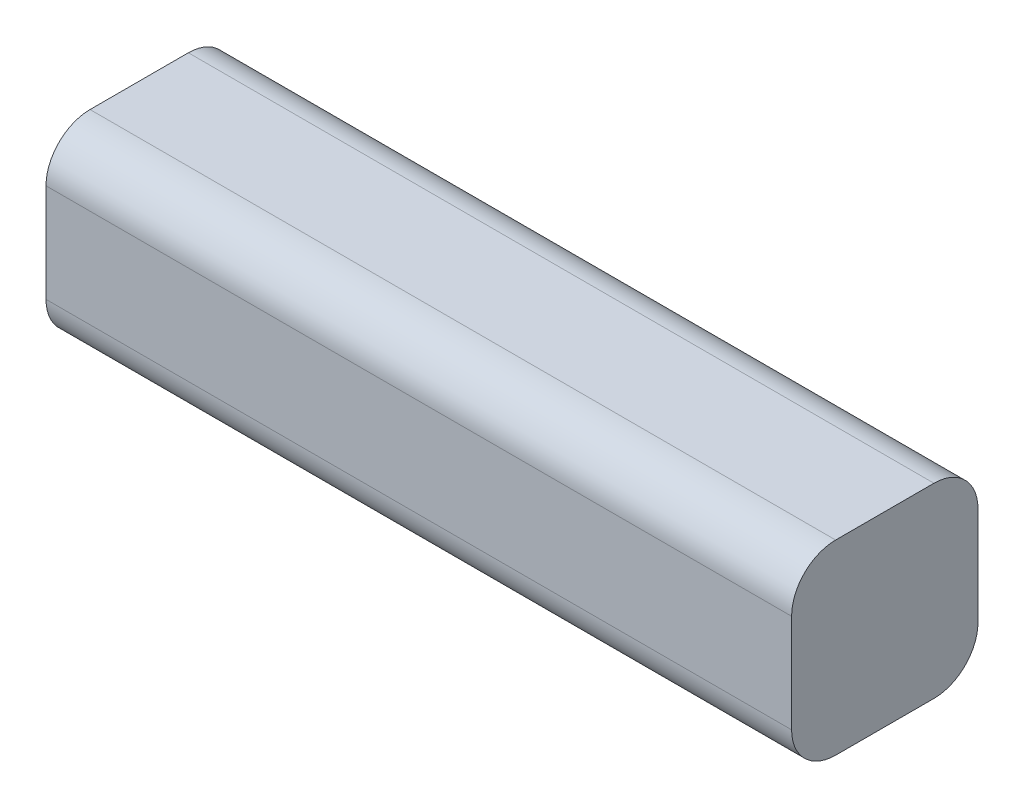
ISO-10303-21;
HEADER;
FILE_DESCRIPTION(('STEP AP214'),'2;1');
FILE_NAME('part.step','',(''),(''),'','','');
FILE_SCHEMA(('AUTOMOTIVE_DESIGN { 1 0 10303 214 1 1 1 1 }'));
ENDSEC;
DATA;
#1=APPLICATION_CONTEXT('core data for automotive mechanical design processes');
#2=APPLICATION_PROTOCOL_DEFINITION('international standard','automotive_design',2000,#1);
#3=PRODUCT_CONTEXT('',#1,'mechanical');
#4=PRODUCT('Part','Part','',(#3));
#5=PRODUCT_RELATED_PRODUCT_CATEGORY('part','',(#4));
#6=PRODUCT_DEFINITION_FORMATION('','',#4);
#7=PRODUCT_DEFINITION_CONTEXT('part definition',#1,'design');
#8=PRODUCT_DEFINITION('design','',#6,#7);
#9=PRODUCT_DEFINITION_SHAPE('','',#8);
#10=(LENGTH_UNIT() NAMED_UNIT(*) SI_UNIT(.MILLI.,.METRE.));
#11=(NAMED_UNIT(*) PLANE_ANGLE_UNIT() SI_UNIT($,.RADIAN.));
#12=(NAMED_UNIT(*) SI_UNIT($,.STERADIAN.) SOLID_ANGLE_UNIT());
#13=UNCERTAINTY_MEASURE_WITH_UNIT(LENGTH_MEASURE(1.E-05),#10,'distance_accuracy_value','');
#14=(GEOMETRIC_REPRESENTATION_CONTEXT(3) GLOBAL_UNCERTAINTY_ASSIGNED_CONTEXT((#13)) GLOBAL_UNIT_ASSIGNED_CONTEXT((#10,
#11,#12)) REPRESENTATION_CONTEXT('',''));
#15=CARTESIAN_POINT('',(0.,0.,0.));
#16=DIRECTION('',(0.,0.,1.));
#17=DIRECTION('',(1.,0.,0.));
#18=AXIS2_PLACEMENT_3D('',#15,#16,#17);
#19=CARTESIAN_POINT('',(0.,38.1,0.));
#20=DIRECTION('',(1.,0.,0.));
#21=DIRECTION('',(0.,0.,-1.));
#22=AXIS2_PLACEMENT_3D('',#19,#20,#21);
#23=PLANE('',#22);
#24=DIRECTION('',(0.,-1.,0.));
#25=VECTOR('',#24,1.);
#26=CARTESIAN_POINT('',(0.,38.1,-38.1));
#27=LINE('',#26,#25);
#28=CARTESIAN_POINT('',(0.,29.1,-38.1));
#29=VERTEX_POINT('',#28);
#30=CARTESIAN_POINT('',(0.,9.00000000000001,-38.1));
#31=VERTEX_POINT('',#30);
#32=EDGE_CURVE('E101',#29,#31,#27,.T.);
#33=ORIENTED_EDGE('',*,*,#32,.T.);
#34=CARTESIAN_POINT('',(0.,9.,-29.1));
#35=DIRECTION('',(1.,0.,0.));
#36=DIRECTION('',(0.,0.,-1.));
#37=AXIS2_PLACEMENT_3D('',#34,#35,#36);
#38=CIRCLE('',#37,9.);
#39=CARTESIAN_POINT('',(0.,0.,-29.1));
#40=VERTEX_POINT('',#39);
#41=EDGE_CURVE('E108',#31,#40,#38,.F.);
#42=ORIENTED_EDGE('',*,*,#41,.T.);
#43=DIRECTION('',(0.,0.,1.));
#44=VECTOR('',#43,1.);
#45=CARTESIAN_POINT('',(0.,0.,0.));
#46=LINE('',#45,#44);
#47=CARTESIAN_POINT('',(0.,0.,-9.));
#48=VERTEX_POINT('',#47);
#49=EDGE_CURVE('E168',#40,#48,#46,.T.);
#50=ORIENTED_EDGE('',*,*,#49,.T.);
#51=CARTESIAN_POINT('',(0.,9.,-9.));
#52=DIRECTION('',(1.,0.,0.));
#53=DIRECTION('',(0.,0.,-1.));
#54=AXIS2_PLACEMENT_3D('',#51,#52,#53);
#55=CIRCLE('',#54,9.);
#56=CARTESIAN_POINT('',(0.,9.00000000000001,0.));
#57=VERTEX_POINT('',#56);
#58=EDGE_CURVE('E109',#48,#57,#55,.F.);
#59=ORIENTED_EDGE('',*,*,#58,.T.);
#60=DIRECTION('',(0.,-1.,0.));
#61=VECTOR('',#60,1.);
#62=CARTESIAN_POINT('',(0.,38.1,0.));
#63=LINE('',#62,#61);
#64=CARTESIAN_POINT('',(0.,29.1,0.));
#65=VERTEX_POINT('',#64);
#66=EDGE_CURVE('E125',#65,#57,#63,.T.);
#67=ORIENTED_EDGE('',*,*,#66,.F.);
#68=CARTESIAN_POINT('',(0.,29.1,-9.));
#69=DIRECTION('',(1.,0.,0.));
#70=DIRECTION('',(0.,0.,-1.));
#71=AXIS2_PLACEMENT_3D('',#68,#69,#70);
#72=CIRCLE('',#71,9.);
#73=CARTESIAN_POINT('',(0.,38.1,-9.));
#74=VERTEX_POINT('',#73);
#75=EDGE_CURVE('E127',#65,#74,#72,.F.);
#76=ORIENTED_EDGE('',*,*,#75,.T.);
#77=DIRECTION('',(0.,0.,1.));
#78=VECTOR('',#77,1.);
#79=CARTESIAN_POINT('',(0.,38.1,0.));
#80=LINE('',#79,#78);
#81=CARTESIAN_POINT('',(0.,38.1,-29.1));
#82=VERTEX_POINT('',#81);
#83=EDGE_CURVE('E103',#82,#74,#80,.T.);
#84=ORIENTED_EDGE('',*,*,#83,.F.);
#85=CARTESIAN_POINT('',(0.,29.1,-29.1));
#86=DIRECTION('',(1.,0.,0.));
#87=DIRECTION('',(0.,0.,-1.));
#88=AXIS2_PLACEMENT_3D('',#85,#86,#87);
#89=CIRCLE('',#88,9.);
#90=EDGE_CURVE('E99',#82,#29,#89,.F.);
#91=ORIENTED_EDGE('',*,*,#90,.T.);
#92=EDGE_LOOP('',(#33,#42,#50,#59,#67,#76,#84,#91));
#93=FACE_BOUND('',#92,.T.);
#94=ADVANCED_FACE('F33',(#93),#23,.F.);
#95=CARTESIAN_POINT('',(0.,38.1,0.));
#96=DIRECTION('',(0.,0.,-1.));
#97=DIRECTION('',(-1.,0.,0.));
#98=AXIS2_PLACEMENT_3D('',#95,#96,#97);
#99=PLANE('',#98);
#100=ORIENTED_EDGE('',*,*,#66,.T.);
#101=DIRECTION('',(1.,0.,0.));
#102=VECTOR('',#101,1.);
#103=CARTESIAN_POINT('',(152.4,9.,0.));
#104=LINE('',#103,#102);
#105=CARTESIAN_POINT('',(152.4,9.00000000000001,0.));
#106=VERTEX_POINT('',#105);
#107=EDGE_CURVE('E11',#57,#106,#104,.T.);
#108=ORIENTED_EDGE('',*,*,#107,.T.);
#109=DIRECTION('',(0.,-1.,0.));
#110=VECTOR('',#109,1.);
#111=CARTESIAN_POINT('',(152.4,38.1,0.));
#112=LINE('',#111,#110);
#113=CARTESIAN_POINT('',(152.4,29.1,0.));
#114=VERTEX_POINT('',#113);
#115=EDGE_CURVE('E130',#114,#106,#112,.T.);
#116=ORIENTED_EDGE('',*,*,#115,.F.);
#117=DIRECTION('',(1.,0.,0.));
#118=VECTOR('',#117,1.);
#119=CARTESIAN_POINT('',(0.,29.1,0.));
#120=LINE('',#119,#118);
#121=EDGE_CURVE('E41',#114,#65,#120,.F.);
#122=ORIENTED_EDGE('',*,*,#121,.T.);
#123=EDGE_LOOP('',(#100,#108,#116,#122));
#124=FACE_BOUND('',#123,.T.);
#125=ADVANCED_FACE('F153',(#124),#99,.F.);
#126=CARTESIAN_POINT('',(152.4,38.1,0.));
#127=DIRECTION('',(-1.,0.,0.));
#128=DIRECTION('',(0.,0.,1.));
#129=AXIS2_PLACEMENT_3D('',#126,#127,#128);
#130=PLANE('',#129);
#131=DIRECTION('',(0.,0.,-1.));
#132=VECTOR('',#131,1.);
#133=CARTESIAN_POINT('',(152.4,0.,0.));
#134=LINE('',#133,#132);
#135=CARTESIAN_POINT('',(152.4,0.,-9.));
#136=VERTEX_POINT('',#135);
#137=CARTESIAN_POINT('',(152.4,0.,-29.1));
#138=VERTEX_POINT('',#137);
#139=EDGE_CURVE('E165',#136,#138,#134,.T.);
#140=ORIENTED_EDGE('',*,*,#139,.T.);
#141=CARTESIAN_POINT('',(152.4,9.,-29.1));
#142=DIRECTION('',(-1.,0.,0.));
#143=DIRECTION('',(0.,0.,1.));
#144=AXIS2_PLACEMENT_3D('',#141,#142,#143);
#145=CIRCLE('',#144,9.);
#146=CARTESIAN_POINT('',(152.4,9.00000000000001,-38.1));
#147=VERTEX_POINT('',#146);
#148=EDGE_CURVE('E144',#138,#147,#145,.F.);
#149=ORIENTED_EDGE('',*,*,#148,.T.);
#150=DIRECTION('',(0.,-1.,0.));
#151=VECTOR('',#150,1.);
#152=CARTESIAN_POINT('',(152.4,38.1,-38.1));
#153=LINE('',#152,#151);
#154=CARTESIAN_POINT('',(152.4,29.1,-38.1));
#155=VERTEX_POINT('',#154);
#156=EDGE_CURVE('E119',#155,#147,#153,.T.);
#157=ORIENTED_EDGE('',*,*,#156,.F.);
#158=CARTESIAN_POINT('',(152.4,29.1,-29.1));
#159=DIRECTION('',(-1.,0.,0.));
#160=DIRECTION('',(0.,0.,1.));
#161=AXIS2_PLACEMENT_3D('',#158,#159,#160);
#162=CIRCLE('',#161,9.);
#163=CARTESIAN_POINT('',(152.4,38.1,-29.1));
#164=VERTEX_POINT('',#163);
#165=EDGE_CURVE('E124',#155,#164,#162,.F.);
#166=ORIENTED_EDGE('',*,*,#165,.T.);
#167=DIRECTION('',(0.,0.,-1.));
#168=VECTOR('',#167,1.);
#169=CARTESIAN_POINT('',(152.4,38.1,0.));
#170=LINE('',#169,#168);
#171=CARTESIAN_POINT('',(152.4,38.1,-9.));
#172=VERTEX_POINT('',#171);
#173=EDGE_CURVE('E120',#172,#164,#170,.T.);
#174=ORIENTED_EDGE('',*,*,#173,.F.);
#175=CARTESIAN_POINT('',(152.4,29.1,-9.));
#176=DIRECTION('',(-1.,0.,0.));
#177=DIRECTION('',(0.,0.,1.));
#178=AXIS2_PLACEMENT_3D('',#175,#176,#177);
#179=CIRCLE('',#178,9.);
#180=EDGE_CURVE('E55',#172,#114,#179,.F.);
#181=ORIENTED_EDGE('',*,*,#180,.T.);
#182=ORIENTED_EDGE('',*,*,#115,.T.);
#183=CARTESIAN_POINT('',(152.4,9.,-9.));
#184=DIRECTION('',(-1.,0.,0.));
#185=DIRECTION('',(0.,0.,1.));
#186=AXIS2_PLACEMENT_3D('',#183,#184,#185);
#187=CIRCLE('',#186,9.);
#188=EDGE_CURVE('E48',#106,#136,#187,.F.);
#189=ORIENTED_EDGE('',*,*,#188,.T.);
#190=EDGE_LOOP('',(#140,#149,#157,#166,#174,#181,#182,#189));
#191=FACE_BOUND('',#190,.T.);
#192=ADVANCED_FACE('F163',(#191),#130,.F.);
#193=CARTESIAN_POINT('',(0.,38.1,-38.1));
#194=DIRECTION('',(0.,0.,1.));
#195=DIRECTION('',(1.,0.,0.));
#196=AXIS2_PLACEMENT_3D('',#193,#194,#195);
#197=PLANE('',#196);
#198=ORIENTED_EDGE('',*,*,#156,.T.);
#199=DIRECTION('',(-1.,0.,0.));
#200=VECTOR('',#199,1.);
#201=CARTESIAN_POINT('',(0.,9.,-38.1));
#202=LINE('',#201,#200);
#203=EDGE_CURVE('E118',#147,#31,#202,.T.);
#204=ORIENTED_EDGE('',*,*,#203,.T.);
#205=ORIENTED_EDGE('',*,*,#32,.F.);
#206=DIRECTION('',(-1.,0.,0.));
#207=VECTOR('',#206,1.);
#208=CARTESIAN_POINT('',(0.,29.1,-38.1));
#209=LINE('',#208,#207);
#210=EDGE_CURVE('E115',#29,#155,#209,.F.);
#211=ORIENTED_EDGE('',*,*,#210,.T.);
#212=EDGE_LOOP('',(#198,#204,#205,#211));
#213=FACE_BOUND('',#212,.T.);
#214=ADVANCED_FACE('F114',(#213),#197,.F.);
#215=CARTESIAN_POINT('',(0.,38.1,0.));
#216=DIRECTION('',(0.,-1.,0.));
#217=DIRECTION('',(0.,0.,-1.));
#218=AXIS2_PLACEMENT_3D('',#215,#216,#217);
#219=PLANE('',#218);
#220=ORIENTED_EDGE('',*,*,#173,.T.);
#221=DIRECTION('',(-1.,0.,0.));
#222=VECTOR('',#221,1.);
#223=CARTESIAN_POINT('',(0.,38.1,-29.1));
#224=LINE('',#223,#222);
#225=EDGE_CURVE('E149',#164,#82,#224,.T.);
#226=ORIENTED_EDGE('',*,*,#225,.T.);
#227=ORIENTED_EDGE('',*,*,#83,.T.);
#228=DIRECTION('',(1.,0.,0.));
#229=VECTOR('',#228,1.);
#230=CARTESIAN_POINT('',(0.,38.1,-9.));
#231=LINE('',#230,#229);
#232=EDGE_CURVE('E146',#74,#172,#231,.T.);
#233=ORIENTED_EDGE('',*,*,#232,.T.);
#234=EDGE_LOOP('',(#220,#226,#227,#233));
#235=FACE_BOUND('',#234,.T.);
#236=ADVANCED_FACE('F161',(#235),#219,.F.);
#237=CARTESIAN_POINT('',(0.,0.,0.));
#238=DIRECTION('',(0.,-1.,0.));
#239=DIRECTION('',(0.,0.,-1.));
#240=AXIS2_PLACEMENT_3D('',#237,#238,#239);
#241=PLANE('',#240);
#242=ORIENTED_EDGE('',*,*,#49,.F.);
#243=DIRECTION('',(-1.,0.,0.));
#244=VECTOR('',#243,1.);
#245=CARTESIAN_POINT('',(152.4,0.,-29.1));
#246=LINE('',#245,#244);
#247=EDGE_CURVE('E139',#40,#138,#246,.F.);
#248=ORIENTED_EDGE('',*,*,#247,.T.);
#249=ORIENTED_EDGE('',*,*,#139,.F.);
#250=DIRECTION('',(1.,0.,0.));
#251=VECTOR('',#250,1.);
#252=CARTESIAN_POINT('',(0.,0.,-9.));
#253=LINE('',#252,#251);
#254=EDGE_CURVE('E137',#136,#48,#253,.F.);
#255=ORIENTED_EDGE('',*,*,#254,.T.);
#256=EDGE_LOOP('',(#242,#248,#249,#255));
#257=FACE_BOUND('',#256,.T.);
#258=ADVANCED_FACE('F175',(#257),#241,.T.);
#259=CARTESIAN_POINT('',(0.,9.,-29.1));
#260=DIRECTION('',(1.,0.,0.));
#261=DIRECTION('',(0.,0.,-1.));
#262=AXIS2_PLACEMENT_3D('',#259,#260,#261);
#263=CYLINDRICAL_SURFACE('',#262,9.);
#264=ORIENTED_EDGE('',*,*,#148,.F.);
#265=ORIENTED_EDGE('',*,*,#247,.F.);
#266=ORIENTED_EDGE('',*,*,#41,.F.);
#267=ORIENTED_EDGE('',*,*,#203,.F.);
#268=EDGE_LOOP('',(#264,#265,#266,#267));
#269=FACE_BOUND('',#268,.T.);
#270=ADVANCED_FACE('F183',(#269),#263,.T.);
#271=CARTESIAN_POINT('',(0.,29.1,-29.1));
#272=DIRECTION('',(-1.,0.,0.));
#273=DIRECTION('',(0.,0.,1.));
#274=AXIS2_PLACEMENT_3D('',#271,#272,#273);
#275=CYLINDRICAL_SURFACE('',#274,9.);
#276=ORIENTED_EDGE('',*,*,#165,.F.);
#277=ORIENTED_EDGE('',*,*,#210,.F.);
#278=ORIENTED_EDGE('',*,*,#90,.F.);
#279=ORIENTED_EDGE('',*,*,#225,.F.);
#280=EDGE_LOOP('',(#276,#277,#278,#279));
#281=FACE_BOUND('',#280,.T.);
#282=ADVANCED_FACE('F123',(#281),#275,.T.);
#283=CARTESIAN_POINT('',(0.,9.,-9.));
#284=DIRECTION('',(-1.,0.,0.));
#285=DIRECTION('',(0.,0.,1.));
#286=AXIS2_PLACEMENT_3D('',#283,#284,#285);
#287=CYLINDRICAL_SURFACE('',#286,9.);
#288=ORIENTED_EDGE('',*,*,#58,.F.);
#289=ORIENTED_EDGE('',*,*,#254,.F.);
#290=ORIENTED_EDGE('',*,*,#188,.F.);
#291=ORIENTED_EDGE('',*,*,#107,.F.);
#292=EDGE_LOOP('',(#288,#289,#290,#291));
#293=FACE_BOUND('',#292,.T.);
#294=ADVANCED_FACE('F177',(#293),#287,.T.);
#295=CARTESIAN_POINT('',(0.,29.1,-9.));
#296=DIRECTION('',(1.,0.,0.));
#297=DIRECTION('',(0.,0.,-1.));
#298=AXIS2_PLACEMENT_3D('',#295,#296,#297);
#299=CYLINDRICAL_SURFACE('',#298,9.);
#300=ORIENTED_EDGE('',*,*,#75,.F.);
#301=ORIENTED_EDGE('',*,*,#121,.F.);
#302=ORIENTED_EDGE('',*,*,#180,.F.);
#303=ORIENTED_EDGE('',*,*,#232,.F.);
#304=EDGE_LOOP('',(#300,#301,#302,#303));
#305=FACE_BOUND('',#304,.T.);
#306=ADVANCED_FACE('F35',(#305),#299,.T.);
#307=CLOSED_SHELL('',(#94,#125,#192,#214,#236,#258,#270,#282,#294,#306));
#308=MANIFOLD_SOLID_BREP('B2',#307);
#309=ADVANCED_BREP_SHAPE_REPRESENTATION('',(#18,#308),#14);
#310=SHAPE_DEFINITION_REPRESENTATION(#9,#309);
ENDSEC;
END-ISO-10303-21;
